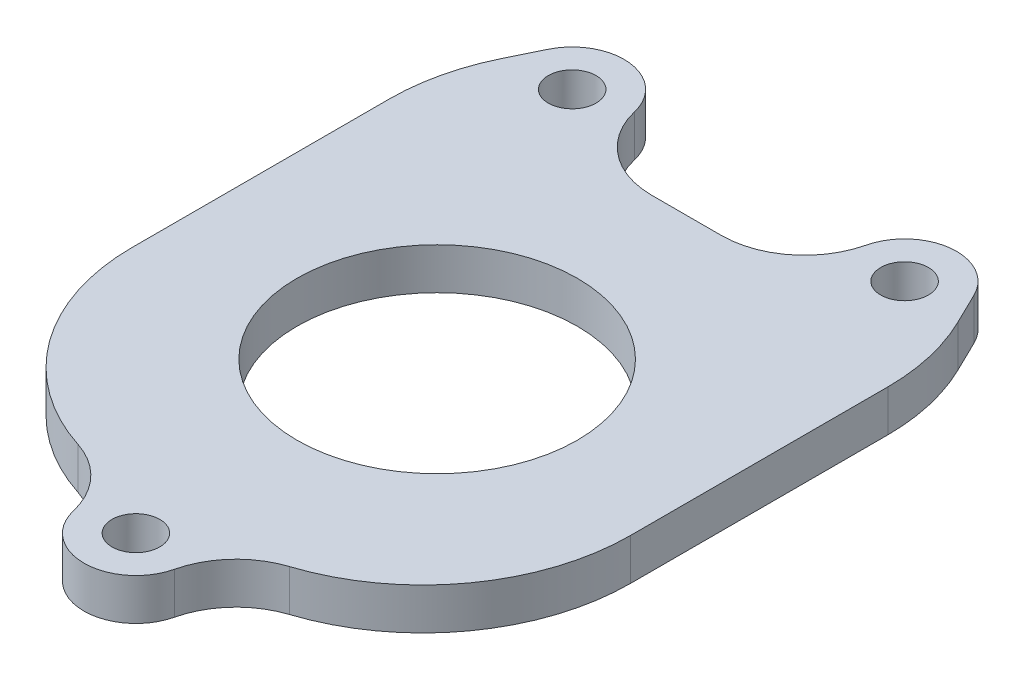
ISO-10303-21;
HEADER;
FILE_DESCRIPTION(('STEP AP214'),'2;1');
FILE_NAME('part.step','',(''),(''),'','','');
FILE_SCHEMA(('AUTOMOTIVE_DESIGN { 1 0 10303 214 1 1 1 1 }'));
ENDSEC;
DATA;
#1=APPLICATION_CONTEXT('core data for automotive mechanical design processes');
#2=APPLICATION_PROTOCOL_DEFINITION('international standard','automotive_design',2000,#1);
#3=PRODUCT_CONTEXT('',#1,'mechanical');
#4=PRODUCT('Part','Part','',(#3));
#5=PRODUCT_RELATED_PRODUCT_CATEGORY('part','',(#4));
#6=PRODUCT_DEFINITION_FORMATION('','',#4);
#7=PRODUCT_DEFINITION_CONTEXT('part definition',#1,'design');
#8=PRODUCT_DEFINITION('design','',#6,#7);
#9=PRODUCT_DEFINITION_SHAPE('','',#8);
#10=(LENGTH_UNIT() NAMED_UNIT(*) SI_UNIT(.MILLI.,.METRE.));
#11=(NAMED_UNIT(*) PLANE_ANGLE_UNIT() SI_UNIT($,.RADIAN.));
#12=(NAMED_UNIT(*) SI_UNIT($,.STERADIAN.) SOLID_ANGLE_UNIT());
#13=UNCERTAINTY_MEASURE_WITH_UNIT(LENGTH_MEASURE(1.E-05),#10,'distance_accuracy_value','');
#14=(GEOMETRIC_REPRESENTATION_CONTEXT(3) GLOBAL_UNCERTAINTY_ASSIGNED_CONTEXT((#13)) GLOBAL_UNIT_ASSIGNED_CONTEXT((#10,
#11,#12)) REPRESENTATION_CONTEXT('',''));
#15=CARTESIAN_POINT('',(0.,0.,0.));
#16=DIRECTION('',(0.,0.,1.));
#17=DIRECTION('',(1.,0.,0.));
#18=AXIS2_PLACEMENT_3D('',#15,#16,#17);
#19=CARTESIAN_POINT('',(12.,2.,-12.));
#20=DIRECTION('',(0.,0.,1.));
#21=DIRECTION('',(1.,0.,0.));
#22=AXIS2_PLACEMENT_3D('',#19,#20,#21);
#23=PLANE('',#22);
#24=DIRECTION('',(-1.,0.,0.));
#25=VECTOR('',#24,1.);
#26=CARTESIAN_POINT('',(12.,2.,-12.));
#27=LINE('',#26,#25);
#28=CARTESIAN_POINT('',(1.67544467966324,2.,-12.));
#29=VERTEX_POINT('',#28);
#30=CARTESIAN_POINT('',(-1.67544467966324,2.,-12.));
#31=VERTEX_POINT('',#30);
#32=EDGE_CURVE('E165',#29,#31,#27,.T.);
#33=ORIENTED_EDGE('',*,*,#32,.F.);
#34=DIRECTION('',(0.,1.,0.));
#35=VECTOR('',#34,1.);
#36=CARTESIAN_POINT('',(1.67544467966324,-13.6014705087354,-12.));
#37=LINE('',#36,#35);
#38=CARTESIAN_POINT('',(1.67544467966324,0.,-12.));
#39=VERTEX_POINT('',#38);
#40=EDGE_CURVE('E164',#39,#29,#37,.T.);
#41=ORIENTED_EDGE('',*,*,#40,.F.);
#42=DIRECTION('',(-1.,0.,0.));
#43=VECTOR('',#42,1.);
#44=CARTESIAN_POINT('',(12.,0.,-12.));
#45=LINE('',#44,#43);
#46=CARTESIAN_POINT('',(-1.67544467966324,0.,-12.));
#47=VERTEX_POINT('',#46);
#48=EDGE_CURVE('E146',#39,#47,#45,.T.);
#49=ORIENTED_EDGE('',*,*,#48,.T.);
#50=DIRECTION('',(0.,1.,0.));
#51=VECTOR('',#50,1.);
#52=CARTESIAN_POINT('',(-1.67544467966324,-13.6014705087354,-12.));
#53=LINE('',#52,#51);
#54=EDGE_CURVE('E205',#47,#31,#53,.T.);
#55=ORIENTED_EDGE('',*,*,#54,.T.);
#56=EDGE_LOOP('',(#33,#41,#49,#55));
#57=FACE_BOUND('',#56,.T.);
#58=ADVANCED_FACE('F34',(#57),#23,.F.);
#59=CARTESIAN_POINT('',(-12.,2.,-12.));
#60=DIRECTION('',(1.,0.,0.));
#61=DIRECTION('',(0.,0.,-1.));
#62=AXIS2_PLACEMENT_3D('',#59,#60,#61);
#63=PLANE('',#62);
#64=DIRECTION('',(0.,0.,1.));
#65=VECTOR('',#64,1.);
#66=CARTESIAN_POINT('',(-12.,2.,-12.));
#67=LINE('',#66,#65);
#68=CARTESIAN_POINT('',(-12.,2.,-9.6923076923077));
#69=VERTEX_POINT('',#68);
#70=CARTESIAN_POINT('',(-12.,2.,2.68466217922553));
#71=VERTEX_POINT('',#70);
#72=EDGE_CURVE('E160',#69,#71,#67,.T.);
#73=ORIENTED_EDGE('',*,*,#72,.F.);
#74=DIRECTION('',(0.,-1.,0.));
#75=VECTOR('',#74,1.);
#76=CARTESIAN_POINT('',(-12.,0.,-9.6923076923077));
#77=LINE('',#76,#75);
#78=CARTESIAN_POINT('',(-12.,0.,-9.6923076923077));
#79=VERTEX_POINT('',#78);
#80=EDGE_CURVE('E42',#69,#79,#77,.T.);
#81=ORIENTED_EDGE('',*,*,#80,.T.);
#82=DIRECTION('',(0.,0.,1.));
#83=VECTOR('',#82,1.);
#84=CARTESIAN_POINT('',(-12.,0.,-12.));
#85=LINE('',#84,#83);
#86=CARTESIAN_POINT('',(-12.,0.,2.68466217922553));
#87=VERTEX_POINT('',#86);
#88=EDGE_CURVE('E230',#79,#87,#85,.T.);
#89=ORIENTED_EDGE('',*,*,#88,.T.);
#90=DIRECTION('',(0.,-1.,0.));
#91=VECTOR('',#90,1.);
#92=CARTESIAN_POINT('',(-12.,2.,2.68466217922553));
#93=LINE('',#92,#91);
#94=EDGE_CURVE('E267',#87,#71,#93,.F.);
#95=ORIENTED_EDGE('',*,*,#94,.T.);
#96=EDGE_LOOP('',(#73,#81,#89,#95));
#97=FACE_BOUND('',#96,.T.);
#98=ADVANCED_FACE('F285',(#97),#63,.F.);
#99=CARTESIAN_POINT('',(12.,2.,-12.));
#100=DIRECTION('',(-1.,0.,0.));
#101=DIRECTION('',(0.,0.,1.));
#102=AXIS2_PLACEMENT_3D('',#99,#100,#101);
#103=PLANE('',#102);
#104=DIRECTION('',(0.,0.,-1.));
#105=VECTOR('',#104,1.);
#106=CARTESIAN_POINT('',(12.,0.,-12.));
#107=LINE('',#106,#105);
#108=CARTESIAN_POINT('',(12.,0.,2.68466217922552));
#109=VERTEX_POINT('',#108);
#110=CARTESIAN_POINT('',(12.,0.,-9.69230769230769));
#111=VERTEX_POINT('',#110);
#112=EDGE_CURVE('E161',#109,#111,#107,.T.);
#113=ORIENTED_EDGE('',*,*,#112,.T.);
#114=DIRECTION('',(0.,-1.,0.));
#115=VECTOR('',#114,1.);
#116=CARTESIAN_POINT('',(12.,2.,-9.69230769230769));
#117=LINE('',#116,#115);
#118=CARTESIAN_POINT('',(12.,2.,-9.69230769230769));
#119=VERTEX_POINT('',#118);
#120=EDGE_CURVE('E277',#111,#119,#117,.F.);
#121=ORIENTED_EDGE('',*,*,#120,.T.);
#122=DIRECTION('',(0.,0.,-1.));
#123=VECTOR('',#122,1.);
#124=CARTESIAN_POINT('',(12.,2.,-12.));
#125=LINE('',#124,#123);
#126=CARTESIAN_POINT('',(12.,2.,2.68466217922552));
#127=VERTEX_POINT('',#126);
#128=EDGE_CURVE('E243',#127,#119,#125,.T.);
#129=ORIENTED_EDGE('',*,*,#128,.F.);
#130=DIRECTION('',(0.,-1.,0.));
#131=VECTOR('',#130,1.);
#132=CARTESIAN_POINT('',(12.,0.,2.68466217922552));
#133=LINE('',#132,#131);
#134=EDGE_CURVE('E247',#127,#109,#133,.T.);
#135=ORIENTED_EDGE('',*,*,#134,.T.);
#136=EDGE_LOOP('',(#113,#121,#129,#135));
#137=FACE_BOUND('',#136,.T.);
#138=ADVANCED_FACE('F314',(#137),#103,.F.);
#139=CARTESIAN_POINT('',(0.,2.,0.));
#140=DIRECTION('',(0.,-1.,0.));
#141=DIRECTION('',(0.,0.,-1.));
#142=AXIS2_PLACEMENT_3D('',#139,#140,#141);
#143=PLANE('',#142);
#144=CARTESIAN_POINT('',(0.,2.,0.));
#145=DIRECTION('',(0.,1.,0.));
#146=DIRECTION('',(0.,0.,1.));
#147=AXIS2_PLACEMENT_3D('',#144,#145,#146);
#148=CIRCLE('',#147,6.75);
#149=CARTESIAN_POINT('',(0.,2.,6.75));
#150=VERTEX_POINT('',#149);
#151=EDGE_CURVE('E566',#150,#150,#148,.T.);
#152=ORIENTED_EDGE('',*,*,#151,.F.);
#153=EDGE_LOOP('',(#152));
#154=FACE_BOUND('',#153,.T.);
#155=ORIENTED_EDGE('',*,*,#128,.T.);
#156=CARTESIAN_POINT('',(2.,2.,-9.69230769230768));
#157=DIRECTION('',(0.,-1.,0.));
#158=DIRECTION('',(0.,0.,-1.));
#159=AXIS2_PLACEMENT_3D('',#156,#157,#158);
#160=CIRCLE('',#159,10.);
#161=CARTESIAN_POINT('',(10.9887640449438,2.,-14.0743301642178));
#162=VERTEX_POINT('',#161);
#163=EDGE_CURVE('E280',#119,#162,#160,.F.);
#164=ORIENTED_EDGE('',*,*,#163,.T.);
#165=DIRECTION('',(-0.43820224719101,0.,-0.898876404494382));
#166=VECTOR('',#165,1.);
#167=CARTESIAN_POINT('',(12.,2.,-12.));
#168=LINE('',#167,#166);
#169=CARTESIAN_POINT('',(10.247191011236,2.,-15.5955056179775));
#170=VERTEX_POINT('',#169);
#171=EDGE_CURVE('E323',#162,#170,#168,.T.);
#172=ORIENTED_EDGE('',*,*,#171,.T.);
#173=CARTESIAN_POINT('',(8.,2.,-14.5));
#174=DIRECTION('',(0.,1.,0.));
#175=DIRECTION('',(0.,0.,-1.));
#176=AXIS2_PLACEMENT_3D('',#173,#174,#175);
#177=CIRCLE('',#176,2.5);
#178=CARTESIAN_POINT('',(5.5674787229474,2.,-15.0769230769231));
#179=VERTEX_POINT('',#178);
#180=EDGE_CURVE('E330',#170,#179,#177,.T.);
#181=ORIENTED_EDGE('',*,*,#180,.T.);
#182=CARTESIAN_POINT('',(1.67544467966324,2.,-16.));
#183=DIRECTION('',(0.,-1.,0.));
#184=DIRECTION('',(0.,0.,-1.));
#185=AXIS2_PLACEMENT_3D('',#182,#183,#184);
#186=CIRCLE('',#185,4.);
#187=EDGE_CURVE('E327',#179,#29,#186,.T.);
#188=ORIENTED_EDGE('',*,*,#187,.T.);
#189=ORIENTED_EDGE('',*,*,#32,.T.);
#190=CARTESIAN_POINT('',(-1.67544467966324,2.,-16.));
#191=DIRECTION('',(0.,-1.,0.));
#192=DIRECTION('',(0.,0.,1.));
#193=AXIS2_PLACEMENT_3D('',#190,#191,#192);
#194=CIRCLE('',#193,4.);
#195=CARTESIAN_POINT('',(-5.5674787229474,2.,-15.0769230769231));
#196=VERTEX_POINT('',#195);
#197=EDGE_CURVE('E188',#31,#196,#194,.T.);
#198=ORIENTED_EDGE('',*,*,#197,.T.);
#199=CARTESIAN_POINT('',(-8.,2.,-14.5));
#200=DIRECTION('',(0.,1.,0.));
#201=DIRECTION('',(0.,0.,1.));
#202=AXIS2_PLACEMENT_3D('',#199,#200,#201);
#203=CIRCLE('',#202,2.5);
#204=CARTESIAN_POINT('',(-10.247191011236,2.,-15.5955056179775));
#205=VERTEX_POINT('',#204);
#206=EDGE_CURVE('E194',#196,#205,#203,.T.);
#207=ORIENTED_EDGE('',*,*,#206,.T.);
#208=DIRECTION('',(-0.43820224719101,0.,0.898876404494383));
#209=VECTOR('',#208,1.);
#210=CARTESIAN_POINT('',(-12.,2.,-12.));
#211=LINE('',#210,#209);
#212=CARTESIAN_POINT('',(-10.9887640449438,2.,-14.0743301642178));
#213=VERTEX_POINT('',#212);
#214=EDGE_CURVE('E192',#205,#213,#211,.T.);
#215=ORIENTED_EDGE('',*,*,#214,.T.);
#216=CARTESIAN_POINT('',(-2.,2.,-9.6923076923077));
#217=DIRECTION('',(0.,-1.,0.));
#218=DIRECTION('',(0.,0.,-1.));
#219=AXIS2_PLACEMENT_3D('',#216,#217,#218);
#220=CIRCLE('',#219,10.);
#221=EDGE_CURVE('E49',#213,#69,#220,.F.);
#222=ORIENTED_EDGE('',*,*,#221,.T.);
#223=ORIENTED_EDGE('',*,*,#72,.T.);
#224=CARTESIAN_POINT('',(-2.,2.,2.68466217922553));
#225=DIRECTION('',(0.,-1.,0.));
#226=DIRECTION('',(0.,0.,-1.));
#227=AXIS2_PLACEMENT_3D('',#224,#225,#226);
#228=CIRCLE('',#227,10.);
#229=CARTESIAN_POINT('',(-5.08896808595482,2.,12.195617765493));
#230=VERTEX_POINT('',#229);
#231=EDGE_CURVE('E260',#71,#230,#228,.F.);
#232=ORIENTED_EDGE('',*,*,#231,.T.);
#233=CARTESIAN_POINT('',(-6.32455532033676,2.,16.));
#234=DIRECTION('',(0.,-1.,0.));
#235=DIRECTION('',(0.,0.,-1.));
#236=AXIS2_PLACEMENT_3D('',#233,#234,#235);
#237=CIRCLE('',#236,4.);
#238=CARTESIAN_POINT('',(-2.4325212770526,2.,15.0769230769231));
#239=VERTEX_POINT('',#238);
#240=EDGE_CURVE('E222',#230,#239,#237,.T.);
#241=ORIENTED_EDGE('',*,*,#240,.T.);
#242=CARTESIAN_POINT('',(0.,2.,14.5));
#243=DIRECTION('',(0.,1.,0.));
#244=DIRECTION('',(0.,0.,1.));
#245=AXIS2_PLACEMENT_3D('',#242,#243,#244);
#246=CIRCLE('',#245,2.5);
#247=CARTESIAN_POINT('',(2.4325212770526,2.,15.0769230769231));
#248=VERTEX_POINT('',#247);
#249=EDGE_CURVE('E219',#239,#248,#246,.T.);
#250=ORIENTED_EDGE('',*,*,#249,.T.);
#251=CARTESIAN_POINT('',(6.32455532033676,2.,16.));
#252=DIRECTION('',(0.,-1.,0.));
#253=DIRECTION('',(0.,0.,1.));
#254=AXIS2_PLACEMENT_3D('',#251,#252,#253);
#255=CIRCLE('',#254,4.);
#256=CARTESIAN_POINT('',(5.08896808595483,2.,12.195617765493));
#257=VERTEX_POINT('',#256);
#258=EDGE_CURVE('E215',#248,#257,#255,.T.);
#259=ORIENTED_EDGE('',*,*,#258,.T.);
#260=CARTESIAN_POINT('',(2.,2.,2.68466217922553));
#261=DIRECTION('',(0.,-1.,0.));
#262=DIRECTION('',(0.,0.,-1.));
#263=AXIS2_PLACEMENT_3D('',#260,#261,#262);
#264=CIRCLE('',#263,10.);
#265=EDGE_CURVE('E262',#257,#127,#264,.F.);
#266=ORIENTED_EDGE('',*,*,#265,.T.);
#267=EDGE_LOOP('',(#155,#164,#172,#181,#188,#189,#198,#207,#215,#222,#223,#232,#241,#250,#259,#266));
#268=FACE_BOUND('',#267,.T.);
#269=CARTESIAN_POINT('',(0.,2.,14.5));
#270=DIRECTION('',(0.,1.,0.));
#271=DIRECTION('',(0.,0.,1.));
#272=AXIS2_PLACEMENT_3D('',#269,#270,#271);
#273=CIRCLE('',#272,1.15);
#274=CARTESIAN_POINT('',(0.,2.,15.65));
#275=VERTEX_POINT('',#274);
#276=EDGE_CURVE('E224',#275,#275,#273,.T.);
#277=ORIENTED_EDGE('',*,*,#276,.F.);
#278=EDGE_LOOP('',(#277));
#279=FACE_BOUND('',#278,.T.);
#280=CARTESIAN_POINT('',(-8.,2.,-14.5));
#281=DIRECTION('',(0.,1.,0.));
#282=DIRECTION('',(0.,0.,1.));
#283=AXIS2_PLACEMENT_3D('',#280,#281,#282);
#284=CIRCLE('',#283,1.15);
#285=CARTESIAN_POINT('',(-8.,2.,-13.35));
#286=VERTEX_POINT('',#285);
#287=EDGE_CURVE('E197',#286,#286,#284,.T.);
#288=ORIENTED_EDGE('',*,*,#287,.F.);
#289=EDGE_LOOP('',(#288));
#290=FACE_BOUND('',#289,.T.);
#291=CARTESIAN_POINT('',(8.,2.,-14.5));
#292=DIRECTION('',(0.,1.,0.));
#293=DIRECTION('',(0.,0.,-1.));
#294=AXIS2_PLACEMENT_3D('',#291,#292,#293);
#295=CIRCLE('',#294,1.15);
#296=CARTESIAN_POINT('',(8.,2.,-15.65));
#297=VERTEX_POINT('',#296);
#298=EDGE_CURVE('E169',#297,#297,#295,.T.);
#299=ORIENTED_EDGE('',*,*,#298,.F.);
#300=EDGE_LOOP('',(#299));
#301=FACE_BOUND('',#300,.T.);
#302=ADVANCED_FACE('F295',(#154,#268,#279,#290,#301),#143,.F.);
#303=CARTESIAN_POINT('',(0.,0.,0.));
#304=DIRECTION('',(0.,-1.,0.));
#305=DIRECTION('',(0.,0.,-1.));
#306=AXIS2_PLACEMENT_3D('',#303,#304,#305);
#307=PLANE('',#306);
#308=CARTESIAN_POINT('',(0.,0.,0.));
#309=DIRECTION('',(0.,-1.,0.));
#310=DIRECTION('',(0.,0.,-1.));
#311=AXIS2_PLACEMENT_3D('',#308,#309,#310);
#312=CIRCLE('',#311,6.75);
#313=CARTESIAN_POINT('',(0.,0.,-6.75));
#314=VERTEX_POINT('',#313);
#315=EDGE_CURVE('E185',#314,#314,#312,.F.);
#316=ORIENTED_EDGE('',*,*,#315,.T.);
#317=EDGE_LOOP('',(#316));
#318=FACE_BOUND('',#317,.T.);
#319=DIRECTION('',(-0.43820224719101,0.,-0.898876404494382));
#320=VECTOR('',#319,1.);
#321=CARTESIAN_POINT('',(12.,0.,-12.));
#322=LINE('',#321,#320);
#323=CARTESIAN_POINT('',(10.9887640449438,0.,-14.0743301642178));
#324=VERTEX_POINT('',#323);
#325=CARTESIAN_POINT('',(10.247191011236,0.,-15.5955056179775));
#326=VERTEX_POINT('',#325);
#327=EDGE_CURVE('E177',#324,#326,#322,.T.);
#328=ORIENTED_EDGE('',*,*,#327,.F.);
#329=CARTESIAN_POINT('',(2.,0.,-9.69230769230768));
#330=DIRECTION('',(0.,-1.,0.));
#331=DIRECTION('',(0.,0.,-1.));
#332=AXIS2_PLACEMENT_3D('',#329,#330,#331);
#333=CIRCLE('',#332,10.);
#334=EDGE_CURVE('E275',#324,#111,#333,.T.);
#335=ORIENTED_EDGE('',*,*,#334,.T.);
#336=ORIENTED_EDGE('',*,*,#112,.F.);
#337=CARTESIAN_POINT('',(2.,0.,2.68466217922553));
#338=DIRECTION('',(0.,-1.,0.));
#339=DIRECTION('',(0.,0.,-1.));
#340=AXIS2_PLACEMENT_3D('',#337,#338,#339);
#341=CIRCLE('',#340,10.);
#342=CARTESIAN_POINT('',(5.08896808595483,0.,12.195617765493));
#343=VERTEX_POINT('',#342);
#344=EDGE_CURVE('E256',#109,#343,#341,.T.);
#345=ORIENTED_EDGE('',*,*,#344,.T.);
#346=CARTESIAN_POINT('',(6.32455532033676,0.,16.));
#347=DIRECTION('',(0.,-1.,0.));
#348=DIRECTION('',(0.,0.,-1.));
#349=AXIS2_PLACEMENT_3D('',#346,#347,#348);
#350=CIRCLE('',#349,4.);
#351=CARTESIAN_POINT('',(2.4325212770526,0.,15.0769230769231));
#352=VERTEX_POINT('',#351);
#353=EDGE_CURVE('E234',#352,#343,#350,.T.);
#354=ORIENTED_EDGE('',*,*,#353,.F.);
#355=CARTESIAN_POINT('',(0.,0.,14.5));
#356=DIRECTION('',(0.,-1.,0.));
#357=DIRECTION('',(0.,0.,-1.));
#358=AXIS2_PLACEMENT_3D('',#355,#356,#357);
#359=CIRCLE('',#358,2.5);
#360=CARTESIAN_POINT('',(-2.4325212770526,0.,15.0769230769231));
#361=VERTEX_POINT('',#360);
#362=EDGE_CURVE('E231',#361,#352,#359,.F.);
#363=ORIENTED_EDGE('',*,*,#362,.F.);
#364=CARTESIAN_POINT('',(-6.32455532033676,0.,16.));
#365=DIRECTION('',(0.,-1.,0.));
#366=DIRECTION('',(0.,0.,-1.));
#367=AXIS2_PLACEMENT_3D('',#364,#365,#366);
#368=CIRCLE('',#367,4.);
#369=CARTESIAN_POINT('',(-5.08896808595482,0.,12.195617765493));
#370=VERTEX_POINT('',#369);
#371=EDGE_CURVE('E203',#370,#361,#368,.T.);
#372=ORIENTED_EDGE('',*,*,#371,.F.);
#373=CARTESIAN_POINT('',(-2.,0.,2.68466217922553));
#374=DIRECTION('',(0.,-1.,0.));
#375=DIRECTION('',(0.,0.,-1.));
#376=AXIS2_PLACEMENT_3D('',#373,#374,#375);
#377=CIRCLE('',#376,10.);
#378=EDGE_CURVE('E253',#370,#87,#377,.T.);
#379=ORIENTED_EDGE('',*,*,#378,.T.);
#380=ORIENTED_EDGE('',*,*,#88,.F.);
#381=CARTESIAN_POINT('',(-2.,0.,-9.6923076923077));
#382=DIRECTION('',(0.,-1.,0.));
#383=DIRECTION('',(0.,0.,-1.));
#384=AXIS2_PLACEMENT_3D('',#381,#382,#383);
#385=CIRCLE('',#384,10.);
#386=CARTESIAN_POINT('',(-10.9887640449438,0.,-14.0743301642178));
#387=VERTEX_POINT('',#386);
#388=EDGE_CURVE('E273',#79,#387,#385,.T.);
#389=ORIENTED_EDGE('',*,*,#388,.T.);
#390=DIRECTION('',(-0.43820224719101,0.,0.898876404494383));
#391=VECTOR('',#390,1.);
#392=CARTESIAN_POINT('',(-12.,0.,-12.));
#393=LINE('',#392,#391);
#394=CARTESIAN_POINT('',(-10.247191011236,0.,-15.5955056179775));
#395=VERTEX_POINT('',#394);
#396=EDGE_CURVE('E200',#395,#387,#393,.T.);
#397=ORIENTED_EDGE('',*,*,#396,.F.);
#398=CARTESIAN_POINT('',(-8.,0.,-14.5));
#399=DIRECTION('',(0.,-1.,0.));
#400=DIRECTION('',(0.,0.,-1.));
#401=AXIS2_PLACEMENT_3D('',#398,#399,#400);
#402=CIRCLE('',#401,2.5);
#403=CARTESIAN_POINT('',(-5.5674787229474,0.,-15.0769230769231));
#404=VERTEX_POINT('',#403);
#405=EDGE_CURVE('E206',#404,#395,#402,.F.);
#406=ORIENTED_EDGE('',*,*,#405,.F.);
#407=CARTESIAN_POINT('',(-1.67544467966324,0.,-16.));
#408=DIRECTION('',(0.,-1.,0.));
#409=DIRECTION('',(0.,0.,-1.));
#410=AXIS2_PLACEMENT_3D('',#407,#408,#409);
#411=CIRCLE('',#410,4.);
#412=EDGE_CURVE('E156',#47,#404,#411,.T.);
#413=ORIENTED_EDGE('',*,*,#412,.F.);
#414=ORIENTED_EDGE('',*,*,#48,.F.);
#415=CARTESIAN_POINT('',(1.67544467966324,0.,-16.));
#416=DIRECTION('',(0.,-1.,0.));
#417=DIRECTION('',(0.,0.,-1.));
#418=AXIS2_PLACEMENT_3D('',#415,#416,#417);
#419=CIRCLE('',#418,4.);
#420=CARTESIAN_POINT('',(5.5674787229474,0.,-15.0769230769231));
#421=VERTEX_POINT('',#420);
#422=EDGE_CURVE('E153',#421,#39,#419,.T.);
#423=ORIENTED_EDGE('',*,*,#422,.F.);
#424=CARTESIAN_POINT('',(8.,0.,-14.5));
#425=DIRECTION('',(0.,-1.,0.));
#426=DIRECTION('',(0.,0.,-1.));
#427=AXIS2_PLACEMENT_3D('',#424,#425,#426);
#428=CIRCLE('',#427,2.5);
#429=EDGE_CURVE('E183',#326,#421,#428,.F.);
#430=ORIENTED_EDGE('',*,*,#429,.F.);
#431=EDGE_LOOP('',(#328,#335,#336,#345,#354,#363,#372,#379,#380,#389,#397,#406,#413,#414,#423,#430));
#432=FACE_BOUND('',#431,.T.);
#433=CARTESIAN_POINT('',(0.,0.,14.5));
#434=DIRECTION('',(0.,-1.,0.));
#435=DIRECTION('',(0.,0.,-1.));
#436=AXIS2_PLACEMENT_3D('',#433,#434,#435);
#437=CIRCLE('',#436,1.15);
#438=CARTESIAN_POINT('',(0.,0.,13.35));
#439=VERTEX_POINT('',#438);
#440=EDGE_CURVE('E218',#439,#439,#437,.F.);
#441=ORIENTED_EDGE('',*,*,#440,.T.);
#442=EDGE_LOOP('',(#441));
#443=FACE_BOUND('',#442,.T.);
#444=CARTESIAN_POINT('',(-8.,0.,-14.5));
#445=DIRECTION('',(0.,-1.,0.));
#446=DIRECTION('',(0.,0.,-1.));
#447=AXIS2_PLACEMENT_3D('',#444,#445,#446);
#448=CIRCLE('',#447,1.15);
#449=CARTESIAN_POINT('',(-8.,0.,-15.65));
#450=VERTEX_POINT('',#449);
#451=EDGE_CURVE('E191',#450,#450,#448,.F.);
#452=ORIENTED_EDGE('',*,*,#451,.T.);
#453=EDGE_LOOP('',(#452));
#454=FACE_BOUND('',#453,.T.);
#455=CARTESIAN_POINT('',(8.,0.,-14.5));
#456=DIRECTION('',(0.,-1.,0.));
#457=DIRECTION('',(0.,0.,-1.));
#458=AXIS2_PLACEMENT_3D('',#455,#456,#457);
#459=CIRCLE('',#458,1.15);
#460=CARTESIAN_POINT('',(8.,0.,-15.65));
#461=VERTEX_POINT('',#460);
#462=EDGE_CURVE('E181',#461,#461,#459,.F.);
#463=ORIENTED_EDGE('',*,*,#462,.T.);
#464=EDGE_LOOP('',(#463));
#465=FACE_BOUND('',#464,.T.);
#466=ADVANCED_FACE('F149',(#318,#432,#443,#454,#465),#307,.T.);
#467=CARTESIAN_POINT('',(-6.32455532033676,-13.6014705087354,16.));
#468=DIRECTION('',(0.,1.,0.));
#469=DIRECTION('',(0.,0.,1.));
#470=AXIS2_PLACEMENT_3D('',#467,#468,#469);
#471=CYLINDRICAL_SURFACE('',#470,4.);
#472=ORIENTED_EDGE('',*,*,#240,.F.);
#473=DIRECTION('',(0.,1.,0.));
#474=VECTOR('',#473,1.);
#475=CARTESIAN_POINT('',(-5.08896808595482,-13.6014705087354,12.195617765493));
#476=LINE('',#475,#474);
#477=EDGE_CURVE('E264',#230,#370,#476,.F.);
#478=ORIENTED_EDGE('',*,*,#477,.T.);
#479=ORIENTED_EDGE('',*,*,#371,.T.);
#480=DIRECTION('',(0.,1.,0.));
#481=VECTOR('',#480,1.);
#482=CARTESIAN_POINT('',(-2.4325212770526,-13.6014705087354,15.0769230769231));
#483=LINE('',#482,#481);
#484=EDGE_CURVE('E236',#361,#239,#483,.T.);
#485=ORIENTED_EDGE('',*,*,#484,.T.);
#486=EDGE_LOOP('',(#472,#478,#479,#485));
#487=FACE_BOUND('',#486,.T.);
#488=ADVANCED_FACE('F298',(#487),#471,.F.);
#489=CARTESIAN_POINT('',(6.32455532033676,-13.6014705087354,16.));
#490=DIRECTION('',(0.,1.,0.));
#491=DIRECTION('',(0.,0.,1.));
#492=AXIS2_PLACEMENT_3D('',#489,#490,#491);
#493=CYLINDRICAL_SURFACE('',#492,4.);
#494=ORIENTED_EDGE('',*,*,#353,.T.);
#495=DIRECTION('',(0.,1.,0.));
#496=VECTOR('',#495,1.);
#497=CARTESIAN_POINT('',(5.08896808595483,-13.6014705087354,12.195617765493));
#498=LINE('',#497,#496);
#499=EDGE_CURVE('E258',#343,#257,#498,.T.);
#500=ORIENTED_EDGE('',*,*,#499,.T.);
#501=ORIENTED_EDGE('',*,*,#258,.F.);
#502=DIRECTION('',(0.,1.,0.));
#503=VECTOR('',#502,1.);
#504=CARTESIAN_POINT('',(2.4325212770526,-13.6014705087354,15.0769230769231));
#505=LINE('',#504,#503);
#506=EDGE_CURVE('E227',#352,#248,#505,.T.);
#507=ORIENTED_EDGE('',*,*,#506,.F.);
#508=EDGE_LOOP('',(#494,#500,#501,#507));
#509=FACE_BOUND('',#508,.T.);
#510=ADVANCED_FACE('F404',(#509),#493,.F.);
#511=CARTESIAN_POINT('',(0.,-13.6014705087354,14.5));
#512=DIRECTION('',(0.,1.,0.));
#513=DIRECTION('',(0.,0.,1.));
#514=AXIS2_PLACEMENT_3D('',#511,#512,#513);
#515=CYLINDRICAL_SURFACE('',#514,2.5);
#516=ORIENTED_EDGE('',*,*,#484,.F.);
#517=ORIENTED_EDGE('',*,*,#362,.T.);
#518=ORIENTED_EDGE('',*,*,#506,.T.);
#519=ORIENTED_EDGE('',*,*,#249,.F.);
#520=EDGE_LOOP('',(#516,#517,#518,#519));
#521=FACE_BOUND('',#520,.T.);
#522=ADVANCED_FACE('F302',(#521),#515,.T.);
#523=CARTESIAN_POINT('',(0.,-13.6014705087354,14.5));
#524=DIRECTION('',(0.,1.,0.));
#525=DIRECTION('',(0.,0.,1.));
#526=AXIS2_PLACEMENT_3D('',#523,#524,#525);
#527=CYLINDRICAL_SURFACE('',#526,1.15);
#528=ORIENTED_EDGE('',*,*,#276,.T.);
#529=EDGE_LOOP('',(#528));
#530=FACE_BOUND('',#529,.T.);
#531=ORIENTED_EDGE('',*,*,#440,.F.);
#532=EDGE_LOOP('',(#531));
#533=FACE_BOUND('',#532,.T.);
#534=ADVANCED_FACE('F397',(#530,#533),#527,.F.);
#535=CARTESIAN_POINT('',(-8.,-13.6014705087354,-14.5));
#536=DIRECTION('',(0.,1.,0.));
#537=DIRECTION('',(0.,0.,1.));
#538=AXIS2_PLACEMENT_3D('',#535,#536,#537);
#539=CYLINDRICAL_SURFACE('',#538,2.5);
#540=DIRECTION('',(0.,1.,0.));
#541=VECTOR('',#540,1.);
#542=CARTESIAN_POINT('',(-5.5674787229474,-13.6014705087354,-15.0769230769231));
#543=LINE('',#542,#541);
#544=EDGE_CURVE('E211',#404,#196,#543,.T.);
#545=ORIENTED_EDGE('',*,*,#544,.F.);
#546=ORIENTED_EDGE('',*,*,#405,.T.);
#547=DIRECTION('',(0.,1.,0.));
#548=VECTOR('',#547,1.);
#549=CARTESIAN_POINT('',(-10.247191011236,-13.6014705087354,-15.5955056179775));
#550=LINE('',#549,#548);
#551=EDGE_CURVE('E209',#395,#205,#550,.T.);
#552=ORIENTED_EDGE('',*,*,#551,.T.);
#553=ORIENTED_EDGE('',*,*,#206,.F.);
#554=EDGE_LOOP('',(#545,#546,#552,#553));
#555=FACE_BOUND('',#554,.T.);
#556=ADVANCED_FACE('F393',(#555),#539,.T.);
#557=CARTESIAN_POINT('',(-1.67544467966324,-13.6014705087354,-16.));
#558=DIRECTION('',(0.,1.,0.));
#559=DIRECTION('',(0.,0.,1.));
#560=AXIS2_PLACEMENT_3D('',#557,#558,#559);
#561=CYLINDRICAL_SURFACE('',#560,4.);
#562=ORIENTED_EDGE('',*,*,#54,.F.);
#563=ORIENTED_EDGE('',*,*,#412,.T.);
#564=ORIENTED_EDGE('',*,*,#544,.T.);
#565=ORIENTED_EDGE('',*,*,#197,.F.);
#566=EDGE_LOOP('',(#562,#563,#564,#565));
#567=FACE_BOUND('',#566,.T.);
#568=ADVANCED_FACE('F390',(#567),#561,.F.);
#569=CARTESIAN_POINT('',(-12.,-13.6014705087354,-12.));
#570=DIRECTION('',(-0.898876404494383,0.,-0.43820224719101));
#571=DIRECTION('',(-0.43820224719101,0.,0.898876404494383));
#572=AXIS2_PLACEMENT_3D('',#569,#570,#571);
#573=PLANE('',#572);
#574=ORIENTED_EDGE('',*,*,#396,.T.);
#575=DIRECTION('',(0.,-1.,0.));
#576=VECTOR('',#575,1.);
#577=CARTESIAN_POINT('',(-10.9887640449438,2.,-14.0743301642178));
#578=LINE('',#577,#576);
#579=EDGE_CURVE('E11',#387,#213,#578,.F.);
#580=ORIENTED_EDGE('',*,*,#579,.T.);
#581=ORIENTED_EDGE('',*,*,#214,.F.);
#582=ORIENTED_EDGE('',*,*,#551,.F.);
#583=EDGE_LOOP('',(#574,#580,#581,#582));
#584=FACE_BOUND('',#583,.T.);
#585=ADVANCED_FACE('F387',(#584),#573,.T.);
#586=CARTESIAN_POINT('',(-8.,-13.6014705087354,-14.5));
#587=DIRECTION('',(0.,1.,0.));
#588=DIRECTION('',(0.,0.,1.));
#589=AXIS2_PLACEMENT_3D('',#586,#587,#588);
#590=CYLINDRICAL_SURFACE('',#589,1.15);
#591=ORIENTED_EDGE('',*,*,#287,.T.);
#592=EDGE_LOOP('',(#591));
#593=FACE_BOUND('',#592,.T.);
#594=ORIENTED_EDGE('',*,*,#451,.F.);
#595=EDGE_LOOP('',(#594));
#596=FACE_BOUND('',#595,.T.);
#597=ADVANCED_FACE('F383',(#593,#596),#590,.F.);
#598=CARTESIAN_POINT('',(8.,-13.6014705087354,-14.5));
#599=DIRECTION('',(0.,1.,0.));
#600=DIRECTION('',(0.,0.,1.));
#601=AXIS2_PLACEMENT_3D('',#598,#599,#600);
#602=CYLINDRICAL_SURFACE('',#601,2.5);
#603=DIRECTION('',(0.,1.,0.));
#604=VECTOR('',#603,1.);
#605=CARTESIAN_POINT('',(10.247191011236,-13.6014705087354,-15.5955056179775));
#606=LINE('',#605,#604);
#607=EDGE_CURVE('E174',#326,#170,#606,.T.);
#608=ORIENTED_EDGE('',*,*,#607,.F.);
#609=ORIENTED_EDGE('',*,*,#429,.T.);
#610=DIRECTION('',(0.,1.,0.));
#611=VECTOR('',#610,1.);
#612=CARTESIAN_POINT('',(5.5674787229474,-13.6014705087354,-15.0769230769231));
#613=LINE('',#612,#611);
#614=EDGE_CURVE('E173',#421,#179,#613,.T.);
#615=ORIENTED_EDGE('',*,*,#614,.T.);
#616=ORIENTED_EDGE('',*,*,#180,.F.);
#617=EDGE_LOOP('',(#608,#609,#615,#616));
#618=FACE_BOUND('',#617,.T.);
#619=ADVANCED_FACE('F380',(#618),#602,.T.);
#620=CARTESIAN_POINT('',(12.,-13.6014705087354,-12.));
#621=DIRECTION('',(0.898876404494383,0.,-0.438202247191011));
#622=DIRECTION('',(-0.43820224719101,0.,-0.898876404494382));
#623=AXIS2_PLACEMENT_3D('',#620,#621,#622);
#624=PLANE('',#623);
#625=ORIENTED_EDGE('',*,*,#171,.F.);
#626=DIRECTION('',(0.,-1.,0.));
#627=VECTOR('',#626,1.);
#628=CARTESIAN_POINT('',(10.9887640449438,0.,-14.0743301642178));
#629=LINE('',#628,#627);
#630=EDGE_CURVE('E270',#162,#324,#629,.T.);
#631=ORIENTED_EDGE('',*,*,#630,.T.);
#632=ORIENTED_EDGE('',*,*,#327,.T.);
#633=ORIENTED_EDGE('',*,*,#607,.T.);
#634=EDGE_LOOP('',(#625,#631,#632,#633));
#635=FACE_BOUND('',#634,.T.);
#636=ADVANCED_FACE('F322',(#635),#624,.T.);
#637=CARTESIAN_POINT('',(1.67544467966324,-13.6014705087354,-16.));
#638=DIRECTION('',(0.,1.,0.));
#639=DIRECTION('',(0.,0.,1.));
#640=AXIS2_PLACEMENT_3D('',#637,#638,#639);
#641=CYLINDRICAL_SURFACE('',#640,4.);
#642=ORIENTED_EDGE('',*,*,#614,.F.);
#643=ORIENTED_EDGE('',*,*,#422,.T.);
#644=ORIENTED_EDGE('',*,*,#40,.T.);
#645=ORIENTED_EDGE('',*,*,#187,.F.);
#646=EDGE_LOOP('',(#642,#643,#644,#645));
#647=FACE_BOUND('',#646,.T.);
#648=ADVANCED_FACE('F172',(#647),#641,.F.);
#649=CARTESIAN_POINT('',(8.,-13.6014705087354,-14.5));
#650=DIRECTION('',(0.,1.,0.));
#651=DIRECTION('',(0.,0.,1.));
#652=AXIS2_PLACEMENT_3D('',#649,#650,#651);
#653=CYLINDRICAL_SURFACE('',#652,1.15);
#654=ORIENTED_EDGE('',*,*,#298,.T.);
#655=EDGE_LOOP('',(#654));
#656=FACE_BOUND('',#655,.T.);
#657=ORIENTED_EDGE('',*,*,#462,.F.);
#658=EDGE_LOOP('',(#657));
#659=FACE_BOUND('',#658,.T.);
#660=ADVANCED_FACE('F338',(#656,#659),#653,.F.);
#661=CARTESIAN_POINT('',(2.,-13.6014705087354,2.68466217922553));
#662=DIRECTION('',(0.,1.,0.));
#663=DIRECTION('',(0.,0.,1.));
#664=AXIS2_PLACEMENT_3D('',#661,#662,#663);
#665=CYLINDRICAL_SURFACE('',#664,10.);
#666=ORIENTED_EDGE('',*,*,#265,.F.);
#667=ORIENTED_EDGE('',*,*,#499,.F.);
#668=ORIENTED_EDGE('',*,*,#344,.F.);
#669=ORIENTED_EDGE('',*,*,#134,.F.);
#670=EDGE_LOOP('',(#666,#667,#668,#669));
#671=FACE_BOUND('',#670,.T.);
#672=ADVANCED_FACE('F311',(#671),#665,.T.);
#673=CARTESIAN_POINT('',(-2.,-13.6014705087354,2.68466217922553));
#674=DIRECTION('',(0.,1.,0.));
#675=DIRECTION('',(0.,0.,1.));
#676=AXIS2_PLACEMENT_3D('',#673,#674,#675);
#677=CYLINDRICAL_SURFACE('',#676,10.);
#678=ORIENTED_EDGE('',*,*,#231,.F.);
#679=ORIENTED_EDGE('',*,*,#94,.F.);
#680=ORIENTED_EDGE('',*,*,#378,.F.);
#681=ORIENTED_EDGE('',*,*,#477,.F.);
#682=EDGE_LOOP('',(#678,#679,#680,#681));
#683=FACE_BOUND('',#682,.T.);
#684=ADVANCED_FACE('F293',(#683),#677,.T.);
#685=CARTESIAN_POINT('',(0.,-19.0918830920368,0.));
#686=DIRECTION('',(0.,1.,0.));
#687=DIRECTION('',(0.,0.,1.));
#688=AXIS2_PLACEMENT_3D('',#685,#686,#687);
#689=CYLINDRICAL_SURFACE('',#688,6.75);
#690=ORIENTED_EDGE('',*,*,#151,.T.);
#691=EDGE_LOOP('',(#690));
#692=FACE_BOUND('',#691,.T.);
#693=ORIENTED_EDGE('',*,*,#315,.F.);
#694=EDGE_LOOP('',(#693));
#695=FACE_BOUND('',#694,.T.);
#696=ADVANCED_FACE('F363',(#692,#695),#689,.F.);
#697=CARTESIAN_POINT('',(2.,-13.6014705087354,-9.69230769230768));
#698=DIRECTION('',(0.,1.,0.));
#699=DIRECTION('',(0.,0.,1.));
#700=AXIS2_PLACEMENT_3D('',#697,#698,#699);
#701=CYLINDRICAL_SURFACE('',#700,10.);
#702=ORIENTED_EDGE('',*,*,#163,.F.);
#703=ORIENTED_EDGE('',*,*,#120,.F.);
#704=ORIENTED_EDGE('',*,*,#334,.F.);
#705=ORIENTED_EDGE('',*,*,#630,.F.);
#706=EDGE_LOOP('',(#702,#703,#704,#705));
#707=FACE_BOUND('',#706,.T.);
#708=ADVANCED_FACE('F319',(#707),#701,.T.);
#709=CARTESIAN_POINT('',(-2.,2.,-9.6923076923077));
#710=DIRECTION('',(0.,1.,0.));
#711=DIRECTION('',(0.,0.,1.));
#712=AXIS2_PLACEMENT_3D('',#709,#710,#711);
#713=CYLINDRICAL_SURFACE('',#712,10.);
#714=ORIENTED_EDGE('',*,*,#221,.F.);
#715=ORIENTED_EDGE('',*,*,#579,.F.);
#716=ORIENTED_EDGE('',*,*,#388,.F.);
#717=ORIENTED_EDGE('',*,*,#80,.F.);
#718=EDGE_LOOP('',(#714,#715,#716,#717));
#719=FACE_BOUND('',#718,.T.);
#720=ADVANCED_FACE('F36',(#719),#713,.T.);
#721=CLOSED_SHELL('',(#58,#98,#138,#302,#466,#488,#510,#522,#534,#556,#568,#585,#597,#619,#636,
#648,#660,#672,#684,#696,#708,#720));
#722=MANIFOLD_SOLID_BREP('B2',#721);
#723=ADVANCED_BREP_SHAPE_REPRESENTATION('',(#18,#722),#14);
#724=SHAPE_DEFINITION_REPRESENTATION(#9,#723);
ENDSEC;
END-ISO-10303-21;
